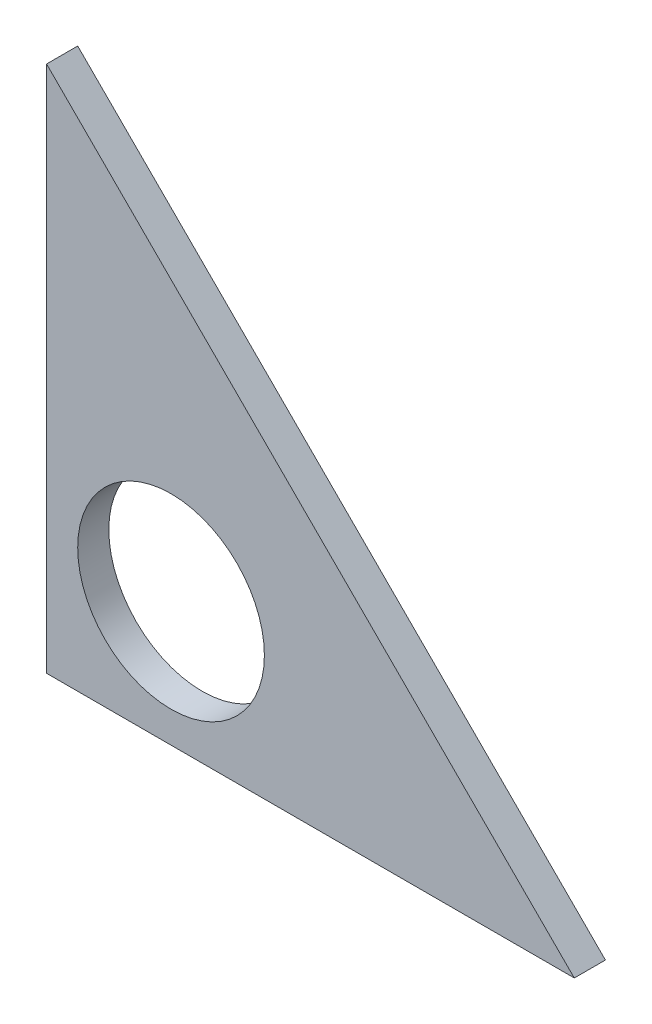
ISO-10303-21;
HEADER;
FILE_DESCRIPTION(('STEP AP214'),'2;1');
FILE_NAME('part.step','',(''),(''),'','','');
FILE_SCHEMA(('AUTOMOTIVE_DESIGN { 1 0 10303 214 1 1 1 1 }'));
ENDSEC;
DATA;
#1=APPLICATION_CONTEXT('core data for automotive mechanical design processes');
#2=APPLICATION_PROTOCOL_DEFINITION('international standard','automotive_design',2000,#1);
#3=PRODUCT_CONTEXT('',#1,'mechanical');
#4=PRODUCT('Part','Part','',(#3));
#5=PRODUCT_RELATED_PRODUCT_CATEGORY('part','',(#4));
#6=PRODUCT_DEFINITION_FORMATION('','',#4);
#7=PRODUCT_DEFINITION_CONTEXT('part definition',#1,'design');
#8=PRODUCT_DEFINITION('design','',#6,#7);
#9=PRODUCT_DEFINITION_SHAPE('','',#8);
#10=(LENGTH_UNIT() NAMED_UNIT(*) SI_UNIT(.MILLI.,.METRE.));
#11=(NAMED_UNIT(*) PLANE_ANGLE_UNIT() SI_UNIT($,.RADIAN.));
#12=(NAMED_UNIT(*) SI_UNIT($,.STERADIAN.) SOLID_ANGLE_UNIT());
#13=UNCERTAINTY_MEASURE_WITH_UNIT(LENGTH_MEASURE(1.E-05),#10,'distance_accuracy_value','');
#14=(GEOMETRIC_REPRESENTATION_CONTEXT(3) GLOBAL_UNCERTAINTY_ASSIGNED_CONTEXT((#13)) GLOBAL_UNIT_ASSIGNED_CONTEXT((#10,
#11,#12)) REPRESENTATION_CONTEXT('',''));
#15=CARTESIAN_POINT('',(0.,0.,0.));
#16=DIRECTION('',(0.,0.,1.));
#17=DIRECTION('',(1.,0.,0.));
#18=AXIS2_PLACEMENT_3D('',#15,#16,#17);
#19=CARTESIAN_POINT('',(25.4,25.4,-152.437460396059));
#20=DIRECTION('',(0.,0.,1.));
#21=DIRECTION('',(1.,0.,0.));
#22=AXIS2_PLACEMENT_3D('',#19,#20,#21);
#23=CYLINDRICAL_SURFACE('',#22,19.05);
#24=CARTESIAN_POINT('',(25.4,25.4,-6.35));
#25=DIRECTION('',(0.,0.,1.));
#26=DIRECTION('',(1.,0.,0.));
#27=AXIS2_PLACEMENT_3D('',#24,#25,#26);
#28=CIRCLE('',#27,19.05);
#29=CARTESIAN_POINT('',(44.45,25.4,-6.35));
#30=VERTEX_POINT('',#29);
#31=EDGE_CURVE('E69',#30,#30,#28,.T.);
#32=ORIENTED_EDGE('',*,*,#31,.F.);
#33=EDGE_LOOP('',(#32));
#34=FACE_BOUND('',#33,.T.);
#35=CARTESIAN_POINT('',(25.4,25.4,0.));
#36=DIRECTION('',(0.,0.,-1.));
#37=DIRECTION('',(0.,-1.,0.));
#38=AXIS2_PLACEMENT_3D('',#35,#36,#37);
#39=CIRCLE('',#38,19.05);
#40=CARTESIAN_POINT('',(25.4,6.35,0.));
#41=VERTEX_POINT('',#40);
#42=EDGE_CURVE('E79',#41,#41,#39,.T.);
#43=ORIENTED_EDGE('',*,*,#42,.F.);
#44=EDGE_LOOP('',(#43));
#45=FACE_BOUND('',#44,.T.);
#46=ADVANCED_FACE('F16',(#34,#45),#23,.F.);
#47=CARTESIAN_POINT('',(0.,107.696,0.));
#48=DIRECTION('',(0.707106781186548,0.707106781186548,0.));
#49=DIRECTION('',(-0.707106781186548,0.707106781186548,0.));
#50=AXIS2_PLACEMENT_3D('',#47,#48,#49);
#51=PLANE('',#50);
#52=DIRECTION('',(-0.707106781186548,0.707106781186548,0.));
#53=VECTOR('',#52,1.);
#54=CARTESIAN_POINT('',(107.696,0.,0.));
#55=LINE('',#54,#53);
#56=CARTESIAN_POINT('',(107.696,0.,0.));
#57=VERTEX_POINT('',#56);
#58=CARTESIAN_POINT('',(0.,107.696,0.));
#59=VERTEX_POINT('',#58);
#60=EDGE_CURVE('E33',#57,#59,#55,.T.);
#61=ORIENTED_EDGE('',*,*,#60,.F.);
#62=DIRECTION('',(0.,0.,-1.));
#63=VECTOR('',#62,1.);
#64=CARTESIAN_POINT('',(107.696,0.,0.));
#65=LINE('',#64,#63);
#66=CARTESIAN_POINT('',(107.696,0.,-6.35));
#67=VERTEX_POINT('',#66);
#68=EDGE_CURVE('E10',#57,#67,#65,.T.);
#69=ORIENTED_EDGE('',*,*,#68,.T.);
#70=DIRECTION('',(0.707106781186548,-0.707106781186548,0.));
#71=VECTOR('',#70,1.);
#72=CARTESIAN_POINT('',(0.,107.696,-6.35));
#73=LINE('',#72,#71);
#74=CARTESIAN_POINT('',(0.,107.696,-6.35));
#75=VERTEX_POINT('',#74);
#76=EDGE_CURVE('E60',#75,#67,#73,.T.);
#77=ORIENTED_EDGE('',*,*,#76,.F.);
#78=DIRECTION('',(0.,0.,-1.));
#79=VECTOR('',#78,1.);
#80=CARTESIAN_POINT('',(0.,107.696,0.));
#81=LINE('',#80,#79);
#82=EDGE_CURVE('E25',#59,#75,#81,.T.);
#83=ORIENTED_EDGE('',*,*,#82,.F.);
#84=EDGE_LOOP('',(#61,#69,#77,#83));
#85=FACE_BOUND('',#84,.T.);
#86=ADVANCED_FACE('F71',(#85),#51,.T.);
#87=CARTESIAN_POINT('',(0.,0.,0.));
#88=DIRECTION('',(-1.,0.,0.));
#89=DIRECTION('',(0.,0.,1.));
#90=AXIS2_PLACEMENT_3D('',#87,#88,#89);
#91=PLANE('',#90);
#92=DIRECTION('',(0.,-1.,0.));
#93=VECTOR('',#92,1.);
#94=CARTESIAN_POINT('',(0.,107.696,0.));
#95=LINE('',#94,#93);
#96=CARTESIAN_POINT('',(0.,0.,0.));
#97=VERTEX_POINT('',#96);
#98=EDGE_CURVE('E47',#59,#97,#95,.T.);
#99=ORIENTED_EDGE('',*,*,#98,.F.);
#100=ORIENTED_EDGE('',*,*,#82,.T.);
#101=DIRECTION('',(0.,1.,0.));
#102=VECTOR('',#101,1.);
#103=CARTESIAN_POINT('',(0.,0.,-6.35));
#104=LINE('',#103,#102);
#105=CARTESIAN_POINT('',(0.,0.,-6.35));
#106=VERTEX_POINT('',#105);
#107=EDGE_CURVE('E53',#106,#75,#104,.T.);
#108=ORIENTED_EDGE('',*,*,#107,.F.);
#109=DIRECTION('',(0.,0.,-1.));
#110=VECTOR('',#109,1.);
#111=CARTESIAN_POINT('',(0.,0.,0.));
#112=LINE('',#111,#110);
#113=EDGE_CURVE('E56',#97,#106,#112,.T.);
#114=ORIENTED_EDGE('',*,*,#113,.F.);
#115=EDGE_LOOP('',(#99,#100,#108,#114));
#116=FACE_BOUND('',#115,.T.);
#117=ADVANCED_FACE('F55',(#116),#91,.T.);
#118=CARTESIAN_POINT('',(107.696,0.,0.));
#119=DIRECTION('',(0.,-1.,0.));
#120=DIRECTION('',(0.,0.,-1.));
#121=AXIS2_PLACEMENT_3D('',#118,#119,#120);
#122=PLANE('',#121);
#123=DIRECTION('',(1.,0.,0.));
#124=VECTOR('',#123,1.);
#125=CARTESIAN_POINT('',(0.,0.,0.));
#126=LINE('',#125,#124);
#127=EDGE_CURVE('E65',#97,#57,#126,.T.);
#128=ORIENTED_EDGE('',*,*,#127,.F.);
#129=ORIENTED_EDGE('',*,*,#113,.T.);
#130=DIRECTION('',(-1.,0.,0.));
#131=VECTOR('',#130,1.);
#132=CARTESIAN_POINT('',(107.696,0.,-6.35));
#133=LINE('',#132,#131);
#134=EDGE_CURVE('E19',#67,#106,#133,.T.);
#135=ORIENTED_EDGE('',*,*,#134,.F.);
#136=ORIENTED_EDGE('',*,*,#68,.F.);
#137=EDGE_LOOP('',(#128,#129,#135,#136));
#138=FACE_BOUND('',#137,.T.);
#139=ADVANCED_FACE('F64',(#138),#122,.T.);
#140=CARTESIAN_POINT('',(38.0762859533332,38.0762859533332,-6.35));
#141=DIRECTION('',(0.,0.,1.));
#142=DIRECTION('',(1.,0.,0.));
#143=AXIS2_PLACEMENT_3D('',#140,#141,#142);
#144=PLANE('',#143);
#145=ORIENTED_EDGE('',*,*,#134,.T.);
#146=ORIENTED_EDGE('',*,*,#107,.T.);
#147=ORIENTED_EDGE('',*,*,#76,.T.);
#148=EDGE_LOOP('',(#145,#146,#147));
#149=FACE_BOUND('',#148,.T.);
#150=ORIENTED_EDGE('',*,*,#31,.T.);
#151=EDGE_LOOP('',(#150));
#152=FACE_BOUND('',#151,.T.);
#153=ADVANCED_FACE('F67',(#149,#152),#144,.F.);
#154=CARTESIAN_POINT('',(38.0762859533332,38.0762859533332,0.));
#155=DIRECTION('',(0.,0.,1.));
#156=DIRECTION('',(1.,0.,0.));
#157=AXIS2_PLACEMENT_3D('',#154,#155,#156);
#158=PLANE('',#157);
#159=ORIENTED_EDGE('',*,*,#127,.T.);
#160=ORIENTED_EDGE('',*,*,#60,.T.);
#161=ORIENTED_EDGE('',*,*,#98,.T.);
#162=EDGE_LOOP('',(#159,#160,#161));
#163=FACE_BOUND('',#162,.T.);
#164=ORIENTED_EDGE('',*,*,#42,.T.);
#165=EDGE_LOOP('',(#164));
#166=FACE_BOUND('',#165,.T.);
#167=ADVANCED_FACE('F72',(#163,#166),#158,.T.);
#168=CLOSED_SHELL('',(#46,#86,#117,#139,#153,#167));
#169=MANIFOLD_SOLID_BREP('B1',#168);
#170=ADVANCED_BREP_SHAPE_REPRESENTATION('',(#18,#169),#14);
#171=SHAPE_DEFINITION_REPRESENTATION(#9,#170);
ENDSEC;
END-ISO-10303-21;
